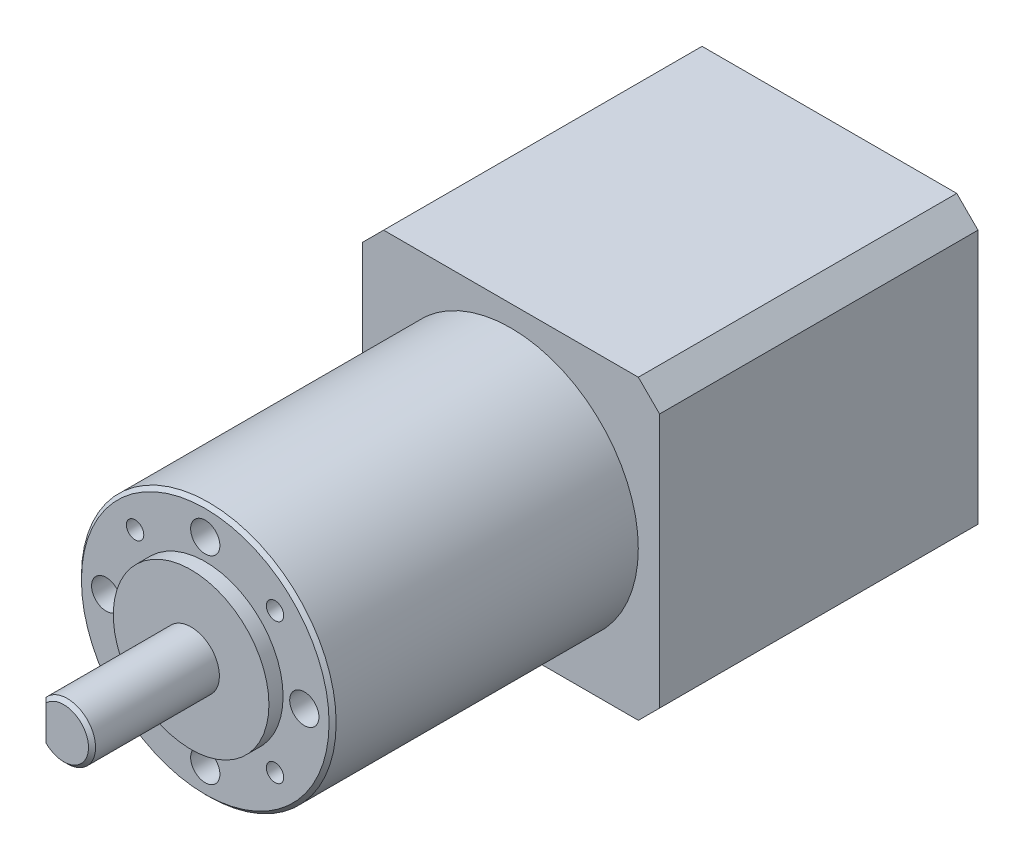
ISO-10303-21;
HEADER;
FILE_DESCRIPTION(('STEP AP214'),'2;1');
FILE_NAME('part.step','',(''),(''),'','','');
FILE_SCHEMA(('AUTOMOTIVE_DESIGN { 1 0 10303 214 1 1 1 1 }'));
ENDSEC;
DATA;
#1=APPLICATION_CONTEXT('core data for automotive mechanical design processes');
#2=APPLICATION_PROTOCOL_DEFINITION('international standard','automotive_design',2000,#1);
#3=PRODUCT_CONTEXT('',#1,'mechanical');
#4=PRODUCT('Part','Part','',(#3));
#5=PRODUCT_RELATED_PRODUCT_CATEGORY('part','',(#4));
#6=PRODUCT_DEFINITION_FORMATION('','',#4);
#7=PRODUCT_DEFINITION_CONTEXT('part definition',#1,'design');
#8=PRODUCT_DEFINITION('design','',#6,#7);
#9=PRODUCT_DEFINITION_SHAPE('','',#8);
#10=(LENGTH_UNIT() NAMED_UNIT(*) SI_UNIT(.MILLI.,.METRE.));
#11=(NAMED_UNIT(*) PLANE_ANGLE_UNIT() SI_UNIT($,.RADIAN.));
#12=(NAMED_UNIT(*) SI_UNIT($,.STERADIAN.) SOLID_ANGLE_UNIT());
#13=UNCERTAINTY_MEASURE_WITH_UNIT(LENGTH_MEASURE(1.E-05),#10,'distance_accuracy_value','');
#14=(GEOMETRIC_REPRESENTATION_CONTEXT(3) GLOBAL_UNCERTAINTY_ASSIGNED_CONTEXT((#13)) GLOBAL_UNIT_ASSIGNED_CONTEXT((#10,
#11,#12)) REPRESENTATION_CONTEXT('',''));
#15=CARTESIAN_POINT('',(0.,0.,0.));
#16=DIRECTION('',(0.,0.,1.));
#17=DIRECTION('',(1.,0.,0.));
#18=AXIS2_PLACEMENT_3D('',#15,#16,#17);
#19=CARTESIAN_POINT('',(42.,0.,45.));
#20=DIRECTION('',(1.,0.,0.));
#21=DIRECTION('',(0.,0.,-1.));
#22=AXIS2_PLACEMENT_3D('',#19,#20,#21);
#23=PLANE('',#22);
#24=DIRECTION('',(0.,1.,0.));
#25=VECTOR('',#24,1.);
#26=CARTESIAN_POINT('',(42.,0.,45.));
#27=LINE('',#26,#25);
#28=CARTESIAN_POINT('',(42.,3.,45.));
#29=VERTEX_POINT('',#28);
#30=CARTESIAN_POINT('',(42.,39.,45.));
#31=VERTEX_POINT('',#30);
#32=EDGE_CURVE('E180',#29,#31,#27,.T.);
#33=ORIENTED_EDGE('',*,*,#32,.F.);
#34=DIRECTION('',(0.,0.,-1.));
#35=VECTOR('',#34,1.);
#36=CARTESIAN_POINT('',(42.,3.,0.));
#37=LINE('',#36,#35);
#38=CARTESIAN_POINT('',(42.,3.,0.));
#39=VERTEX_POINT('',#38);
#40=EDGE_CURVE('E193',#29,#39,#37,.T.);
#41=ORIENTED_EDGE('',*,*,#40,.T.);
#42=DIRECTION('',(0.,1.,0.));
#43=VECTOR('',#42,1.);
#44=CARTESIAN_POINT('',(42.,0.,0.));
#45=LINE('',#44,#43);
#46=CARTESIAN_POINT('',(42.,39.,0.));
#47=VERTEX_POINT('',#46);
#48=EDGE_CURVE('E175',#39,#47,#45,.T.);
#49=ORIENTED_EDGE('',*,*,#48,.T.);
#50=DIRECTION('',(0.,0.,1.));
#51=VECTOR('',#50,1.);
#52=CARTESIAN_POINT('',(42.,39.,45.));
#53=LINE('',#52,#51);
#54=EDGE_CURVE('E183',#47,#31,#53,.T.);
#55=ORIENTED_EDGE('',*,*,#54,.T.);
#56=EDGE_LOOP('',(#33,#41,#49,#55));
#57=FACE_BOUND('',#56,.T.);
#58=ADVANCED_FACE('F46',(#57),#23,.T.);
#59=CARTESIAN_POINT('',(0.,0.,45.));
#60=DIRECTION('',(0.,0.,1.));
#61=DIRECTION('',(1.,0.,0.));
#62=AXIS2_PLACEMENT_3D('',#59,#60,#61);
#63=PLANE('',#62);
#64=CARTESIAN_POINT('',(20.9927320480347,21.0290622711182,45.));
#65=DIRECTION('',(0.,0.,1.));
#66=DIRECTION('',(1.,0.,0.));
#67=AXIS2_PLACEMENT_3D('',#64,#65,#66);
#68=CIRCLE('',#67,18.);
#69=CARTESIAN_POINT('',(2.99273204803469,21.0290622711182,45.));
#70=VERTEX_POINT('',#69);
#71=EDGE_CURVE('E162',#70,#70,#68,.T.);
#72=ORIENTED_EDGE('',*,*,#71,.F.);
#73=EDGE_LOOP('',(#72));
#74=FACE_BOUND('',#73,.T.);
#75=DIRECTION('',(1.,0.,0.));
#76=VECTOR('',#75,1.);
#77=CARTESIAN_POINT('',(0.,0.,45.));
#78=LINE('',#77,#76);
#79=CARTESIAN_POINT('',(3.00000000000001,0.,45.));
#80=VERTEX_POINT('',#79);
#81=CARTESIAN_POINT('',(39.,0.,45.));
#82=VERTEX_POINT('',#81);
#83=EDGE_CURVE('E171',#80,#82,#78,.T.);
#84=ORIENTED_EDGE('',*,*,#83,.T.);
#85=DIRECTION('',(0.707106781186551,0.707106781186544,0.));
#86=VECTOR('',#85,1.);
#87=CARTESIAN_POINT('',(19.4999999999998,-19.5,45.));
#88=LINE('',#87,#86);
#89=EDGE_CURVE('E214',#82,#29,#88,.T.);
#90=ORIENTED_EDGE('',*,*,#89,.T.);
#91=ORIENTED_EDGE('',*,*,#32,.T.);
#92=DIRECTION('',(0.707106781186544,-0.707106781186551,0.));
#93=VECTOR('',#92,1.);
#94=CARTESIAN_POINT('',(40.5000000000002,40.4999999999998,45.));
#95=LINE('',#94,#93);
#96=CARTESIAN_POINT('',(39.,42.,45.));
#97=VERTEX_POINT('',#96);
#98=EDGE_CURVE('E210',#31,#97,#95,.F.);
#99=ORIENTED_EDGE('',*,*,#98,.T.);
#100=DIRECTION('',(1.,0.,0.));
#101=VECTOR('',#100,1.);
#102=CARTESIAN_POINT('',(0.,42.,45.));
#103=LINE('',#102,#101);
#104=CARTESIAN_POINT('',(2.99999999999997,42.,45.));
#105=VERTEX_POINT('',#104);
#106=EDGE_CURVE('E172',#105,#97,#103,.T.);
#107=ORIENTED_EDGE('',*,*,#106,.F.);
#108=DIRECTION('',(0.707106781186546,0.707106781186549,0.));
#109=VECTOR('',#108,1.);
#110=CARTESIAN_POINT('',(-19.5,19.4999999999999,45.));
#111=LINE('',#110,#109);
#112=CARTESIAN_POINT('',(0.,39.,45.));
#113=VERTEX_POINT('',#112);
#114=EDGE_CURVE('E208',#105,#113,#111,.F.);
#115=ORIENTED_EDGE('',*,*,#114,.T.);
#116=DIRECTION('',(0.,1.,0.));
#117=VECTOR('',#116,1.);
#118=CARTESIAN_POINT('',(0.,0.,45.));
#119=LINE('',#118,#117);
#120=CARTESIAN_POINT('',(0.,3.,45.));
#121=VERTEX_POINT('',#120);
#122=EDGE_CURVE('E184',#121,#113,#119,.T.);
#123=ORIENTED_EDGE('',*,*,#122,.F.);
#124=DIRECTION('',(0.707106781186551,-0.707106781186544,0.));
#125=VECTOR('',#124,1.);
#126=CARTESIAN_POINT('',(1.49999999999998,1.50000000000002,45.));
#127=LINE('',#126,#125);
#128=EDGE_CURVE('E212',#121,#80,#127,.T.);
#129=ORIENTED_EDGE('',*,*,#128,.T.);
#130=EDGE_LOOP('',(#84,#90,#91,#99,#107,#115,#123,#129));
#131=FACE_BOUND('',#130,.T.);
#132=ADVANCED_FACE('F254',(#74,#131),#63,.T.);
#133=CARTESIAN_POINT('',(0.,0.,0.));
#134=DIRECTION('',(-1.,0.,0.));
#135=DIRECTION('',(0.,0.,1.));
#136=AXIS2_PLACEMENT_3D('',#133,#134,#135);
#137=PLANE('',#136);
#138=DIRECTION('',(0.,1.,0.));
#139=VECTOR('',#138,1.);
#140=CARTESIAN_POINT('',(0.,0.,0.));
#141=LINE('',#140,#139);
#142=CARTESIAN_POINT('',(0.,3.,0.));
#143=VERTEX_POINT('',#142);
#144=CARTESIAN_POINT('',(0.,39.,0.));
#145=VERTEX_POINT('',#144);
#146=EDGE_CURVE('E187',#143,#145,#141,.T.);
#147=ORIENTED_EDGE('',*,*,#146,.F.);
#148=DIRECTION('',(0.,0.,1.));
#149=VECTOR('',#148,1.);
#150=CARTESIAN_POINT('',(0.,3.,45.));
#151=LINE('',#150,#149);
#152=EDGE_CURVE('E218',#143,#121,#151,.T.);
#153=ORIENTED_EDGE('',*,*,#152,.T.);
#154=ORIENTED_EDGE('',*,*,#122,.T.);
#155=DIRECTION('',(0.,0.,-1.));
#156=VECTOR('',#155,1.);
#157=CARTESIAN_POINT('',(0.,39.,0.));
#158=LINE('',#157,#156);
#159=EDGE_CURVE('E216',#113,#145,#158,.T.);
#160=ORIENTED_EDGE('',*,*,#159,.T.);
#161=EDGE_LOOP('',(#147,#153,#154,#160));
#162=FACE_BOUND('',#161,.T.);
#163=ADVANCED_FACE('F260',(#162),#137,.T.);
#164=CARTESIAN_POINT('',(42.,0.,0.));
#165=DIRECTION('',(0.,0.,-1.));
#166=DIRECTION('',(-1.,0.,0.));
#167=AXIS2_PLACEMENT_3D('',#164,#165,#166);
#168=PLANE('',#167);
#169=ORIENTED_EDGE('',*,*,#48,.F.);
#170=DIRECTION('',(-0.707106781186551,-0.707106781186544,0.));
#171=VECTOR('',#170,1.);
#172=CARTESIAN_POINT('',(40.5,1.50000000000002,0.));
#173=LINE('',#172,#171);
#174=CARTESIAN_POINT('',(39.,0.,0.));
#175=VERTEX_POINT('',#174);
#176=EDGE_CURVE('E202',#39,#175,#173,.T.);
#177=ORIENTED_EDGE('',*,*,#176,.T.);
#178=DIRECTION('',(-1.,0.,0.));
#179=VECTOR('',#178,1.);
#180=CARTESIAN_POINT('',(42.,0.,0.));
#181=LINE('',#180,#179);
#182=CARTESIAN_POINT('',(3.00000000000001,0.,0.));
#183=VERTEX_POINT('',#182);
#184=EDGE_CURVE('E168',#175,#183,#181,.T.);
#185=ORIENTED_EDGE('',*,*,#184,.T.);
#186=DIRECTION('',(-0.707106781186551,0.707106781186544,0.));
#187=VECTOR('',#186,1.);
#188=CARTESIAN_POINT('',(22.5000000000002,-19.5,0.));
#189=LINE('',#188,#187);
#190=EDGE_CURVE('E200',#183,#143,#189,.T.);
#191=ORIENTED_EDGE('',*,*,#190,.T.);
#192=ORIENTED_EDGE('',*,*,#146,.T.);
#193=DIRECTION('',(-0.707106781186546,-0.707106781186549,0.));
#194=VECTOR('',#193,1.);
#195=CARTESIAN_POINT('',(1.4999999999999,40.4999999999999,0.));
#196=LINE('',#195,#194);
#197=CARTESIAN_POINT('',(2.99999999999997,42.,0.));
#198=VERTEX_POINT('',#197);
#199=EDGE_CURVE('E196',#145,#198,#196,.F.);
#200=ORIENTED_EDGE('',*,*,#199,.T.);
#201=DIRECTION('',(-1.,0.,0.));
#202=VECTOR('',#201,1.);
#203=CARTESIAN_POINT('',(42.,42.,0.));
#204=LINE('',#203,#202);
#205=CARTESIAN_POINT('',(39.,42.,0.));
#206=VERTEX_POINT('',#205);
#207=EDGE_CURVE('E167',#206,#198,#204,.T.);
#208=ORIENTED_EDGE('',*,*,#207,.F.);
#209=DIRECTION('',(-0.707106781186544,0.707106781186551,0.));
#210=VECTOR('',#209,1.);
#211=CARTESIAN_POINT('',(61.5,19.4999999999998,0.));
#212=LINE('',#211,#210);
#213=EDGE_CURVE('E198',#206,#47,#212,.F.);
#214=ORIENTED_EDGE('',*,*,#213,.T.);
#215=EDGE_LOOP('',(#169,#177,#185,#191,#192,#200,#208,#214));
#216=FACE_BOUND('',#215,.T.);
#217=ADVANCED_FACE('F266',(#216),#168,.T.);
#218=CARTESIAN_POINT('',(0.,0.,0.));
#219=DIRECTION('',(0.,1.,0.));
#220=DIRECTION('',(0.,0.,1.));
#221=AXIS2_PLACEMENT_3D('',#218,#219,#220);
#222=PLANE('',#221);
#223=ORIENTED_EDGE('',*,*,#184,.F.);
#224=DIRECTION('',(0.,0.,1.));
#225=VECTOR('',#224,1.);
#226=CARTESIAN_POINT('',(39.,0.,45.));
#227=LINE('',#226,#225);
#228=EDGE_CURVE('E206',#175,#82,#227,.T.);
#229=ORIENTED_EDGE('',*,*,#228,.T.);
#230=ORIENTED_EDGE('',*,*,#83,.F.);
#231=DIRECTION('',(0.,0.,-1.));
#232=VECTOR('',#231,1.);
#233=CARTESIAN_POINT('',(3.00000000000001,0.,0.));
#234=LINE('',#233,#232);
#235=EDGE_CURVE('E204',#80,#183,#234,.T.);
#236=ORIENTED_EDGE('',*,*,#235,.T.);
#237=EDGE_LOOP('',(#223,#229,#230,#236));
#238=FACE_BOUND('',#237,.T.);
#239=ADVANCED_FACE('F303',(#238),#222,.F.);
#240=CARTESIAN_POINT('',(0.,42.,0.));
#241=DIRECTION('',(0.,1.,0.));
#242=DIRECTION('',(0.,0.,1.));
#243=AXIS2_PLACEMENT_3D('',#240,#241,#242);
#244=PLANE('',#243);
#245=ORIENTED_EDGE('',*,*,#106,.T.);
#246=DIRECTION('',(0.,0.,-1.));
#247=VECTOR('',#246,1.);
#248=CARTESIAN_POINT('',(39.,42.,0.));
#249=LINE('',#248,#247);
#250=EDGE_CURVE('E224',#97,#206,#249,.T.);
#251=ORIENTED_EDGE('',*,*,#250,.T.);
#252=ORIENTED_EDGE('',*,*,#207,.T.);
#253=DIRECTION('',(0.,0.,1.));
#254=VECTOR('',#253,1.);
#255=CARTESIAN_POINT('',(2.99999999999997,42.,0.));
#256=LINE('',#255,#254);
#257=EDGE_CURVE('E221',#198,#105,#256,.T.);
#258=ORIENTED_EDGE('',*,*,#257,.T.);
#259=EDGE_LOOP('',(#245,#251,#252,#258));
#260=FACE_BOUND('',#259,.T.);
#261=ADVANCED_FACE('F292',(#260),#244,.T.);
#262=CARTESIAN_POINT('',(20.9927320480347,21.0290622711182,88.2));
#263=DIRECTION('',(0.,0.,-1.));
#264=DIRECTION('',(-1.,0.,0.));
#265=AXIS2_PLACEMENT_3D('',#262,#263,#264);
#266=CYLINDRICAL_SURFACE('',#265,18.);
#267=CARTESIAN_POINT('',(20.9927320480347,21.0290622711182,87.6999999999999));
#268=DIRECTION('',(0.,0.,1.));
#269=DIRECTION('',(1.,0.,0.));
#270=AXIS2_PLACEMENT_3D('',#267,#268,#269);
#271=CIRCLE('',#270,18.);
#272=CARTESIAN_POINT('',(2.99273204803469,21.0290622711182,87.6999999999999));
#273=VERTEX_POINT('',#272);
#274=EDGE_CURVE('E13',#273,#273,#271,.F.);
#275=CARTESIAN_POINT('',(2.99273204803469,21.0290622711182,87.6999999999999));
#276=CARTESIAN_POINT('',(2.99273204803469,21.0290622711182,87.2552083333332));
#277=CARTESIAN_POINT('',(2.99273204803469,21.0290622711182,86.8104166666666));
#278=CARTESIAN_POINT('',(2.99273204803469,21.0290622711182,85.9208333333332));
#279=CARTESIAN_POINT('',(2.99273204803469,21.0290622711182,85.4760416666666));
#280=CARTESIAN_POINT('',(2.99273204803469,21.0290622711182,84.5864583333332));
#281=CARTESIAN_POINT('',(2.99273204803469,21.0290622711182,84.1416666666666));
#282=CARTESIAN_POINT('',(2.99273204803469,21.0290622711182,83.2520833333332));
#283=CARTESIAN_POINT('',(2.99273204803469,21.0290622711182,82.8072916666666));
#284=CARTESIAN_POINT('',(2.99273204803469,21.0290622711182,81.9177083333332));
#285=CARTESIAN_POINT('',(2.99273204803469,21.0290622711182,81.4729166666666));
#286=CARTESIAN_POINT('',(2.99273204803469,21.0290622711182,80.5833333333332));
#287=CARTESIAN_POINT('',(2.99273204803469,21.0290622711182,80.1385416666666));
#288=CARTESIAN_POINT('',(2.99273204803469,21.0290622711182,79.2489583333332));
#289=CARTESIAN_POINT('',(2.99273204803469,21.0290622711182,78.8041666666666));
#290=CARTESIAN_POINT('',(2.99273204803469,21.0290622711182,77.9145833333332));
#291=CARTESIAN_POINT('',(2.99273204803469,21.0290622711182,77.4697916666666));
#292=CARTESIAN_POINT('',(2.99273204803469,21.0290622711182,76.5802083333333));
#293=CARTESIAN_POINT('',(2.99273204803469,21.0290622711182,76.1354166666666));
#294=CARTESIAN_POINT('',(2.99273204803469,21.0290622711182,75.2458333333333));
#295=CARTESIAN_POINT('',(2.99273204803469,21.0290622711182,74.8010416666666));
#296=CARTESIAN_POINT('',(2.99273204803469,21.0290622711182,73.9114583333333));
#297=CARTESIAN_POINT('',(2.99273204803469,21.0290622711182,73.4666666666666));
#298=CARTESIAN_POINT('',(2.99273204803469,21.0290622711182,72.5770833333333));
#299=CARTESIAN_POINT('',(2.99273204803469,21.0290622711182,72.1322916666666));
#300=CARTESIAN_POINT('',(2.99273204803469,21.0290622711182,71.2427083333333));
#301=CARTESIAN_POINT('',(2.99273204803469,21.0290622711182,70.7979166666666));
#302=CARTESIAN_POINT('',(2.99273204803469,21.0290622711182,69.9083333333333));
#303=CARTESIAN_POINT('',(2.99273204803469,21.0290622711182,69.4635416666666));
#304=CARTESIAN_POINT('',(2.99273204803469,21.0290622711182,68.5739583333333));
#305=CARTESIAN_POINT('',(2.99273204803469,21.0290622711182,68.1291666666666));
#306=CARTESIAN_POINT('',(2.99273204803469,21.0290622711182,67.2395833333333));
#307=CARTESIAN_POINT('',(2.99273204803469,21.0290622711182,66.7947916666666));
#308=CARTESIAN_POINT('',(2.99273204803469,21.0290622711182,65.9052083333333));
#309=CARTESIAN_POINT('',(2.99273204803469,21.0290622711182,65.4604166666666));
#310=CARTESIAN_POINT('',(2.99273204803469,21.0290622711182,64.5708333333333));
#311=CARTESIAN_POINT('',(2.99273204803469,21.0290622711182,64.1260416666666));
#312=CARTESIAN_POINT('',(2.99273204803469,21.0290622711182,63.2364583333333));
#313=CARTESIAN_POINT('',(2.99273204803469,21.0290622711182,62.7916666666666));
#314=CARTESIAN_POINT('',(2.99273204803469,21.0290622711182,61.9020833333333));
#315=CARTESIAN_POINT('',(2.99273204803469,21.0290622711182,61.4572916666666));
#316=CARTESIAN_POINT('',(2.99273204803469,21.0290622711182,60.5677083333333));
#317=CARTESIAN_POINT('',(2.99273204803469,21.0290622711182,60.1229166666666));
#318=CARTESIAN_POINT('',(2.99273204803469,21.0290622711182,59.2333333333333));
#319=CARTESIAN_POINT('',(2.99273204803469,21.0290622711182,58.7885416666666));
#320=CARTESIAN_POINT('',(2.99273204803469,21.0290622711182,57.8989583333333));
#321=CARTESIAN_POINT('',(2.99273204803469,21.0290622711182,57.4541666666666));
#322=CARTESIAN_POINT('',(2.99273204803469,21.0290622711182,56.5645833333333));
#323=CARTESIAN_POINT('',(2.99273204803469,21.0290622711182,56.1197916666666));
#324=CARTESIAN_POINT('',(2.99273204803469,21.0290622711182,55.2302083333333));
#325=CARTESIAN_POINT('',(2.99273204803469,21.0290622711182,54.7854166666666));
#326=CARTESIAN_POINT('',(2.99273204803469,21.0290622711182,53.8958333333333));
#327=CARTESIAN_POINT('',(2.99273204803469,21.0290622711182,53.4510416666666));
#328=CARTESIAN_POINT('',(2.99273204803469,21.0290622711182,52.5614583333333));
#329=CARTESIAN_POINT('',(2.99273204803469,21.0290622711182,52.1166666666666));
#330=CARTESIAN_POINT('',(2.99273204803469,21.0290622711182,51.2270833333333));
#331=CARTESIAN_POINT('',(2.99273204803469,21.0290622711182,50.7822916666666));
#332=CARTESIAN_POINT('',(2.99273204803469,21.0290622711182,49.8927083333333));
#333=CARTESIAN_POINT('',(2.99273204803469,21.0290622711182,49.4479166666667));
#334=CARTESIAN_POINT('',(2.99273204803469,21.0290622711182,48.5583333333333));
#335=CARTESIAN_POINT('',(2.99273204803469,21.0290622711182,48.1135416666667));
#336=CARTESIAN_POINT('',(2.99273204803469,21.0290622711182,47.2239583333333));
#337=CARTESIAN_POINT('',(2.99273204803469,21.0290622711182,46.7791666666667));
#338=CARTESIAN_POINT('',(2.99273204803469,21.0290622711182,45.8895833333333));
#339=CARTESIAN_POINT('',(2.99273204803469,21.0290622711182,45.4447916666667));
#340=CARTESIAN_POINT('',(2.99273204803469,21.0290622711182,45.));
#341=B_SPLINE_CURVE_WITH_KNOTS('',3,(#275,#276,#277,#278,#279,#280,#281,#282,#283,#284,#285,
#286,#287,#288,#289,#290,#291,#292,#293,#294,#295,#296,#297,#298,#299,#300,#301,#302,#303,#304,
#305,#306,#307,#308,#309,#310,#311,#312,#313,#314,#315,#316,#317,#318,#319,#320,#321,#322,#323,
#324,#325,#326,#327,#328,#329,#330,#331,#332,#333,#334,#335,#336,#337,#338,#339,#340),
.UNSPECIFIED.,.F.,.F.,(4,2,2,2,2,2,2,2,2,2,2,2,2,2,2,2,2,2,2,2,2,2,2,2,2,2,2,2,2,2,2,2,4),(0.,
1.334375,2.66875,4.003125,5.3375,6.67187499999999,8.00624999999999,9.34062499999999,10.675,
12.009375,13.34375,14.678125,16.0125,17.346875,18.68125,20.015625,21.35,22.684375,24.01875,
25.3531249999999,26.6874999999999,28.0218749999999,29.3562499999999,30.6906249999999,
32.0249999999999,33.3593749999999,34.6937499999999,36.0281249999999,37.3624999999999,
38.6968749999999,40.0312499999999,41.3656249999999,42.6999999999999),.UNSPECIFIED.);
#342=EDGE_CURVE('BSEAM317',#273,#70,#341,.T.);
#343=ORIENTED_EDGE('',*,*,#274,.T.);
#344=ORIENTED_EDGE('',*,*,#71,.T.);
#345=ORIENTED_EDGE('',*,*,#342,.T.);
#346=ORIENTED_EDGE('',*,*,#342,.F.);
#347=EDGE_LOOP('',(#343,#345,#344,#346));
#348=FACE_BOUND('',#347,.T.);
#349=ADVANCED_FACE('F317',(#348),#266,.T.);
#350=CARTESIAN_POINT('',(20.9927320480347,21.0290622711182,88.2));
#351=DIRECTION('',(0.,0.,1.));
#352=DIRECTION('',(1.,0.,0.));
#353=AXIS2_PLACEMENT_3D('',#350,#351,#352);
#354=PLANE('',#353);
#355=CARTESIAN_POINT('',(20.9927320480347,21.0290622711182,88.2));
#356=DIRECTION('',(0.,0.,1.));
#357=DIRECTION('',(1.,0.,0.));
#358=AXIS2_PLACEMENT_3D('',#355,#356,#357);
#359=CIRCLE('',#358,17.4999999999999);
#360=CARTESIAN_POINT('',(38.4927320480346,21.0290622711182,88.2));
#361=VERTEX_POINT('',#360);
#362=EDGE_CURVE('E59',#361,#361,#359,.T.);
#363=ORIENTED_EDGE('',*,*,#362,.T.);
#364=EDGE_LOOP('',(#363));
#365=FACE_BOUND('',#364,.T.);
#366=CARTESIAN_POINT('',(6.9927320480347,21.0290622711182,88.2));
#367=DIRECTION('',(0.,0.,1.));
#368=DIRECTION('',(1.,0.,0.));
#369=AXIS2_PLACEMENT_3D('',#366,#367,#368);
#370=CIRCLE('',#369,2.06699999999999);
#371=CARTESIAN_POINT('',(9.05973204803469,21.0290622711182,88.2));
#372=VERTEX_POINT('',#371);
#373=EDGE_CURVE('E415',#372,#372,#370,.T.);
#374=ORIENTED_EDGE('',*,*,#373,.F.);
#375=EDGE_LOOP('',(#374));
#376=FACE_BOUND('',#375,.T.);
#377=CARTESIAN_POINT('',(34.9927320480347,21.0290622711182,88.2));
#378=DIRECTION('',(0.,0.,1.));
#379=DIRECTION('',(1.,0.,0.));
#380=AXIS2_PLACEMENT_3D('',#377,#378,#379);
#381=CIRCLE('',#380,2.06699999999999);
#382=CARTESIAN_POINT('',(37.0597320480347,21.0290622711182,88.2));
#383=VERTEX_POINT('',#382);
#384=EDGE_CURVE('E418',#383,#383,#381,.T.);
#385=ORIENTED_EDGE('',*,*,#384,.F.);
#386=EDGE_LOOP('',(#385));
#387=FACE_BOUND('',#386,.T.);
#388=CARTESIAN_POINT('',(20.9927320480346,7.0290622711182,88.2));
#389=DIRECTION('',(0.,0.,1.));
#390=DIRECTION('',(1.,0.,0.));
#391=AXIS2_PLACEMENT_3D('',#388,#389,#390);
#392=CIRCLE('',#391,2.06699999999999);
#393=CARTESIAN_POINT('',(23.0597320480346,7.0290622711182,88.2));
#394=VERTEX_POINT('',#393);
#395=EDGE_CURVE('E426',#394,#394,#392,.T.);
#396=ORIENTED_EDGE('',*,*,#395,.F.);
#397=EDGE_LOOP('',(#396));
#398=FACE_BOUND('',#397,.T.);
#399=CARTESIAN_POINT('',(20.9927320480347,35.0290622711182,88.2));
#400=DIRECTION('',(0.,0.,1.));
#401=DIRECTION('',(1.,0.,0.));
#402=AXIS2_PLACEMENT_3D('',#399,#400,#401);
#403=CIRCLE('',#402,2.06699999999999);
#404=CARTESIAN_POINT('',(23.0597320480347,35.0290622711182,88.2));
#405=VERTEX_POINT('',#404);
#406=EDGE_CURVE('E432',#405,#405,#403,.T.);
#407=ORIENTED_EDGE('',*,*,#406,.F.);
#408=EDGE_LOOP('',(#407));
#409=FACE_BOUND('',#408,.T.);
#410=CARTESIAN_POINT('',(11.0757648944855,30.9626388549805,88.2));
#411=DIRECTION('',(0.,0.,1.));
#412=DIRECTION('',(1.,0.,0.));
#413=AXIS2_PLACEMENT_3D('',#410,#411,#412);
#414=CIRCLE('',#413,1.22949999999999);
#415=CARTESIAN_POINT('',(12.3052648944855,30.9626388549805,88.2));
#416=VERTEX_POINT('',#415);
#417=EDGE_CURVE('E438',#416,#416,#414,.T.);
#418=ORIENTED_EDGE('',*,*,#417,.F.);
#419=EDGE_LOOP('',(#418));
#420=FACE_BOUND('',#419,.T.);
#421=CARTESIAN_POINT('',(30.8575010299683,30.9626388549805,88.2));
#422=DIRECTION('',(0.,0.,1.));
#423=DIRECTION('',(1.,0.,0.));
#424=AXIS2_PLACEMENT_3D('',#421,#422,#423);
#425=CIRCLE('',#424,1.22949999999999);
#426=CARTESIAN_POINT('',(32.0870010299683,30.9626388549805,88.2));
#427=VERTEX_POINT('',#426);
#428=EDGE_CURVE('E444',#427,#427,#425,.T.);
#429=ORIENTED_EDGE('',*,*,#428,.F.);
#430=EDGE_LOOP('',(#429));
#431=FACE_BOUND('',#430,.T.);
#432=CARTESIAN_POINT('',(11.0757648944855,11.1431205272675,88.2));
#433=DIRECTION('',(0.,0.,1.));
#434=DIRECTION('',(1.,0.,0.));
#435=AXIS2_PLACEMENT_3D('',#432,#433,#434);
#436=CIRCLE('',#435,1.22949999999999);
#437=CARTESIAN_POINT('',(12.3052648944855,11.1431205272675,88.2));
#438=VERTEX_POINT('',#437);
#439=EDGE_CURVE('E450',#438,#438,#436,.T.);
#440=ORIENTED_EDGE('',*,*,#439,.F.);
#441=EDGE_LOOP('',(#440));
#442=FACE_BOUND('',#441,.T.);
#443=CARTESIAN_POINT('',(30.8575010299683,11.1431205272675,88.2));
#444=DIRECTION('',(0.,0.,1.));
#445=DIRECTION('',(1.,0.,0.));
#446=AXIS2_PLACEMENT_3D('',#443,#444,#445);
#447=CIRCLE('',#446,1.22949999999999);
#448=CARTESIAN_POINT('',(32.0870010299683,11.1431205272675,88.2));
#449=VERTEX_POINT('',#448);
#450=EDGE_CURVE('E456',#449,#449,#447,.T.);
#451=ORIENTED_EDGE('',*,*,#450,.F.);
#452=EDGE_LOOP('',(#451));
#453=FACE_BOUND('',#452,.T.);
#454=CARTESIAN_POINT('',(20.9927320480347,21.0290622711182,88.2));
#455=DIRECTION('',(0.,0.,1.));
#456=DIRECTION('',(1.,0.,0.));
#457=AXIS2_PLACEMENT_3D('',#454,#455,#456);
#458=CIRCLE('',#457,11.);
#459=CARTESIAN_POINT('',(31.9927320480347,21.0290622711182,88.2));
#460=VERTEX_POINT('',#459);
#461=EDGE_CURVE('E158',#460,#460,#458,.T.);
#462=ORIENTED_EDGE('',*,*,#461,.F.);
#463=EDGE_LOOP('',(#462));
#464=FACE_BOUND('',#463,.T.);
#465=ADVANCED_FACE('F322',(#365,#376,#387,#398,#409,#420,#431,#442,#453,#464),#354,.T.);
#466=CARTESIAN_POINT('',(20.9927320480347,21.0290622711182,90.2));
#467=DIRECTION('',(0.,0.,-1.));
#468=DIRECTION('',(-1.,0.,0.));
#469=AXIS2_PLACEMENT_3D('',#466,#467,#468);
#470=CYLINDRICAL_SURFACE('',#469,11.);
#471=CARTESIAN_POINT('',(20.9927320480347,21.0290622711182,90.2));
#472=DIRECTION('',(0.,0.,1.));
#473=DIRECTION('',(1.,0.,0.));
#474=AXIS2_PLACEMENT_3D('',#471,#472,#473);
#475=CIRCLE('',#474,11.);
#476=CARTESIAN_POINT('',(31.9927320480347,21.0290622711182,90.2));
#477=VERTEX_POINT('',#476);
#478=EDGE_CURVE('E159',#477,#477,#475,.T.);
#479=ORIENTED_EDGE('',*,*,#478,.F.);
#480=EDGE_LOOP('',(#479));
#481=FACE_BOUND('',#480,.T.);
#482=ORIENTED_EDGE('',*,*,#461,.T.);
#483=EDGE_LOOP('',(#482));
#484=FACE_BOUND('',#483,.T.);
#485=ADVANCED_FACE('F326',(#481,#484),#470,.T.);
#486=CARTESIAN_POINT('',(20.9927320480347,21.0290622711182,90.2));
#487=DIRECTION('',(0.,0.,1.));
#488=DIRECTION('',(1.,0.,0.));
#489=AXIS2_PLACEMENT_3D('',#486,#487,#488);
#490=PLANE('',#489);
#491=CARTESIAN_POINT('',(20.9927320480347,21.0290622711182,90.2));
#492=DIRECTION('',(0.,0.,1.));
#493=DIRECTION('',(1.,0.,0.));
#494=AXIS2_PLACEMENT_3D('',#491,#492,#493);
#495=CIRCLE('',#494,4.);
#496=CARTESIAN_POINT('',(24.9927320480347,21.0290622711182,90.2));
#497=VERTEX_POINT('',#496);
#498=EDGE_CURVE('E153',#497,#497,#495,.T.);
#499=ORIENTED_EDGE('',*,*,#498,.F.);
#500=EDGE_LOOP('',(#499));
#501=FACE_BOUND('',#500,.T.);
#502=ORIENTED_EDGE('',*,*,#478,.T.);
#503=EDGE_LOOP('',(#502));
#504=FACE_BOUND('',#503,.T.);
#505=ADVANCED_FACE('F330',(#501,#504),#490,.T.);
#506=CARTESIAN_POINT('',(20.9927320480347,21.0290622711182,108.2));
#507=DIRECTION('',(0.,0.,-1.));
#508=DIRECTION('',(-1.,0.,0.));
#509=AXIS2_PLACEMENT_3D('',#506,#507,#508);
#510=CYLINDRICAL_SURFACE('',#509,4.);
#511=DIRECTION('',(0.,0.,1.));
#512=VECTOR('',#511,1.);
#513=CARTESIAN_POINT('',(18.0045451470441,23.6881484007403,93.2));
#514=LINE('',#513,#512);
#515=CARTESIAN_POINT('',(18.0045451470441,23.6881484007403,93.2));
#516=VERTEX_POINT('',#515);
#517=CARTESIAN_POINT('',(18.0045451470441,23.6881484007403,107.7));
#518=VERTEX_POINT('',#517);
#519=EDGE_CURVE('E146',#516,#518,#514,.T.);
#520=ORIENTED_EDGE('',*,*,#519,.T.);
#521=CARTESIAN_POINT('',(20.9927320480347,21.0290622711182,107.7));
#522=DIRECTION('',(0.,0.,1.));
#523=DIRECTION('',(1.,0.,0.));
#524=AXIS2_PLACEMENT_3D('',#521,#522,#523);
#525=CIRCLE('',#524,4.);
#526=CARTESIAN_POINT('',(17.9875202144451,18.3892323835586,107.7));
#527=VERTEX_POINT('',#526);
#528=EDGE_CURVE('E151',#518,#527,#525,.F.);
#529=ORIENTED_EDGE('',*,*,#528,.T.);
#530=DIRECTION('',(0.,0.,1.));
#531=VECTOR('',#530,1.);
#532=CARTESIAN_POINT('',(17.9875202144451,18.3892323835586,93.2));
#533=LINE('',#532,#531);
#534=CARTESIAN_POINT('',(17.9875202144451,18.3892323835586,93.2));
#535=VERTEX_POINT('',#534);
#536=EDGE_CURVE('E145',#535,#527,#533,.T.);
#537=ORIENTED_EDGE('',*,*,#536,.F.);
#538=CARTESIAN_POINT('',(20.9927320480347,21.0290622711182,93.2));
#539=DIRECTION('',(0.,0.,1.));
#540=DIRECTION('',(1.,0.,0.));
#541=AXIS2_PLACEMENT_3D('',#538,#539,#540);
#542=CIRCLE('',#541,4.);
#543=EDGE_CURVE('E136',#516,#535,#542,.T.);
#544=ORIENTED_EDGE('',*,*,#543,.F.);
#545=EDGE_LOOP('',(#520,#529,#537,#544));
#546=FACE_BOUND('',#545,.T.);
#547=ORIENTED_EDGE('',*,*,#498,.T.);
#548=EDGE_LOOP('',(#547));
#549=FACE_BOUND('',#548,.T.);
#550=ADVANCED_FACE('F149',(#546,#549),#510,.T.);
#551=CARTESIAN_POINT('',(20.9927320480347,21.0290622711182,108.2));
#552=DIRECTION('',(0.,0.,1.));
#553=DIRECTION('',(1.,0.,0.));
#554=AXIS2_PLACEMENT_3D('',#551,#552,#553);
#555=PLANE('',#554);
#556=DIRECTION('',(-0.00321289197115424,-0.999994838649271,0.));
#557=VECTOR('',#556,1.);
#558=CARTESIAN_POINT('',(18.4875176337699,18.387625937573,108.2));
#559=LINE('',#558,#557);
#560=CARTESIAN_POINT('',(18.503910804098,23.4899094455133,108.2));
#561=VERTEX_POINT('',#560);
#562=CARTESIAN_POINT('',(18.4881493960408,18.5842584468145,108.2));
#563=VERTEX_POINT('',#562);
#564=EDGE_CURVE('E227',#561,#563,#559,.T.);
#565=ORIENTED_EDGE('',*,*,#564,.T.);
#566=CARTESIAN_POINT('',(20.9927320480347,21.0290622711182,108.2));
#567=DIRECTION('',(0.,0.,1.));
#568=DIRECTION('',(1.,0.,0.));
#569=AXIS2_PLACEMENT_3D('',#566,#567,#568);
#570=CIRCLE('',#569,3.49999999999984);
#571=EDGE_CURVE('E229',#563,#561,#570,.T.);
#572=ORIENTED_EDGE('',*,*,#571,.T.);
#573=EDGE_LOOP('',(#565,#572));
#574=FACE_BOUND('',#573,.T.);
#575=ADVANCED_FACE('F337',(#574),#555,.T.);
#576=CARTESIAN_POINT('',(17.9875202144451,18.3892323835586,93.2));
#577=DIRECTION('',(0.999994838649271,-0.00321289197115424,0.));
#578=DIRECTION('',(0.00321289197115424,0.999994838649271,0.));
#579=AXIS2_PLACEMENT_3D('',#576,#577,#578);
#580=PLANE('',#579);
#581=ORIENTED_EDGE('',*,*,#536,.T.);
#582=DIRECTION('',(0.00321289197115424,0.999994838649271,0.));
#583=VECTOR('',#582,1.);
#584=CARTESIAN_POINT('',(18.0045451470441,23.6881484007403,107.7));
#585=LINE('',#584,#583);
#586=EDGE_CURVE('E67',#527,#518,#585,.T.);
#587=ORIENTED_EDGE('',*,*,#586,.T.);
#588=ORIENTED_EDGE('',*,*,#519,.F.);
#589=DIRECTION('',(0.00321289197115424,0.999994838649271,0.));
#590=VECTOR('',#589,1.);
#591=CARTESIAN_POINT('',(17.9875202144451,18.3892323835586,93.2));
#592=LINE('',#591,#590);
#593=EDGE_CURVE('E139',#535,#516,#592,.T.);
#594=ORIENTED_EDGE('',*,*,#593,.F.);
#595=EDGE_LOOP('',(#581,#587,#588,#594));
#596=FACE_BOUND('',#595,.T.);
#597=ADVANCED_FACE('F144',(#596),#580,.F.);
#598=CARTESIAN_POINT('',(20.9927320480347,21.0290622711182,93.2));
#599=DIRECTION('',(0.,0.,1.));
#600=DIRECTION('',(1.,0.,0.));
#601=AXIS2_PLACEMENT_3D('',#598,#599,#600);
#602=PLANE('',#601);
#603=ORIENTED_EDGE('',*,*,#543,.T.);
#604=ORIENTED_EDGE('',*,*,#593,.T.);
#605=EDGE_LOOP('',(#603,#604));
#606=FACE_BOUND('',#605,.T.);
#607=ADVANCED_FACE('F138',(#606),#602,.T.);
#608=CARTESIAN_POINT('',(30.8575010299683,11.1431205272675,84.2));
#609=DIRECTION('',(0.,0.,-1.));
#610=DIRECTION('',(-1.,0.,0.));
#611=AXIS2_PLACEMENT_3D('',#608,#609,#610);
#612=PLANE('',#611);
#613=CARTESIAN_POINT('',(30.8575010299683,11.1431205272675,84.2));
#614=DIRECTION('',(0.,0.,1.));
#615=DIRECTION('',(1.,0.,0.));
#616=AXIS2_PLACEMENT_3D('',#613,#614,#615);
#617=CIRCLE('',#616,1.22949999999999);
#618=CARTESIAN_POINT('',(32.0870010299683,11.1431205272675,84.2));
#619=VERTEX_POINT('',#618);
#620=EDGE_CURVE('E142',#619,#619,#617,.T.);
#621=ORIENTED_EDGE('',*,*,#620,.T.);
#622=EDGE_LOOP('',(#621));
#623=FACE_BOUND('',#622,.T.);
#624=ADVANCED_FACE('F345',(#623),#612,.F.);
#625=CARTESIAN_POINT('',(30.8575010299683,11.1431205272675,88.2));
#626=DIRECTION('',(0.,0.,1.));
#627=DIRECTION('',(1.,0.,0.));
#628=AXIS2_PLACEMENT_3D('',#625,#626,#627);
#629=CYLINDRICAL_SURFACE('',#628,1.22949999999999);
#630=ORIENTED_EDGE('',*,*,#620,.F.);
#631=EDGE_LOOP('',(#630));
#632=FACE_BOUND('',#631,.T.);
#633=ORIENTED_EDGE('',*,*,#450,.T.);
#634=EDGE_LOOP('',(#633));
#635=FACE_BOUND('',#634,.T.);
#636=ADVANCED_FACE('F348',(#632,#635),#629,.F.);
#637=CARTESIAN_POINT('',(11.0757648944855,11.1431205272675,84.2));
#638=DIRECTION('',(0.,0.,-1.));
#639=DIRECTION('',(-1.,0.,0.));
#640=AXIS2_PLACEMENT_3D('',#637,#638,#639);
#641=PLANE('',#640);
#642=CARTESIAN_POINT('',(11.0757648944855,11.1431205272675,84.2));
#643=DIRECTION('',(0.,0.,1.));
#644=DIRECTION('',(1.,0.,0.));
#645=AXIS2_PLACEMENT_3D('',#642,#643,#644);
#646=CIRCLE('',#645,1.22949999999999);
#647=CARTESIAN_POINT('',(12.3052648944855,11.1431205272675,84.2));
#648=VERTEX_POINT('',#647);
#649=EDGE_CURVE('E453',#648,#648,#646,.T.);
#650=ORIENTED_EDGE('',*,*,#649,.T.);
#651=EDGE_LOOP('',(#650));
#652=FACE_BOUND('',#651,.T.);
#653=ADVANCED_FACE('F352',(#652),#641,.F.);
#654=CARTESIAN_POINT('',(11.0757648944855,11.1431205272675,88.2));
#655=DIRECTION('',(0.,0.,1.));
#656=DIRECTION('',(1.,0.,0.));
#657=AXIS2_PLACEMENT_3D('',#654,#655,#656);
#658=CYLINDRICAL_SURFACE('',#657,1.22949999999999);
#659=ORIENTED_EDGE('',*,*,#649,.F.);
#660=EDGE_LOOP('',(#659));
#661=FACE_BOUND('',#660,.T.);
#662=ORIENTED_EDGE('',*,*,#439,.T.);
#663=EDGE_LOOP('',(#662));
#664=FACE_BOUND('',#663,.T.);
#665=ADVANCED_FACE('F356',(#661,#664),#658,.F.);
#666=CARTESIAN_POINT('',(30.8575010299683,30.9626388549805,84.2));
#667=DIRECTION('',(0.,0.,-1.));
#668=DIRECTION('',(-1.,0.,0.));
#669=AXIS2_PLACEMENT_3D('',#666,#667,#668);
#670=PLANE('',#669);
#671=CARTESIAN_POINT('',(30.8575010299683,30.9626388549805,84.2));
#672=DIRECTION('',(0.,0.,1.));
#673=DIRECTION('',(1.,0.,0.));
#674=AXIS2_PLACEMENT_3D('',#671,#672,#673);
#675=CIRCLE('',#674,1.22949999999999);
#676=CARTESIAN_POINT('',(32.0870010299683,30.9626388549805,84.2));
#677=VERTEX_POINT('',#676);
#678=EDGE_CURVE('E447',#677,#677,#675,.T.);
#679=ORIENTED_EDGE('',*,*,#678,.T.);
#680=EDGE_LOOP('',(#679));
#681=FACE_BOUND('',#680,.T.);
#682=ADVANCED_FACE('F360',(#681),#670,.F.);
#683=CARTESIAN_POINT('',(30.8575010299683,30.9626388549805,88.2));
#684=DIRECTION('',(0.,0.,1.));
#685=DIRECTION('',(1.,0.,0.));
#686=AXIS2_PLACEMENT_3D('',#683,#684,#685);
#687=CYLINDRICAL_SURFACE('',#686,1.22949999999999);
#688=ORIENTED_EDGE('',*,*,#678,.F.);
#689=EDGE_LOOP('',(#688));
#690=FACE_BOUND('',#689,.T.);
#691=ORIENTED_EDGE('',*,*,#428,.T.);
#692=EDGE_LOOP('',(#691));
#693=FACE_BOUND('',#692,.T.);
#694=ADVANCED_FACE('F364',(#690,#693),#687,.F.);
#695=CARTESIAN_POINT('',(11.0757648944855,30.9626388549805,84.2));
#696=DIRECTION('',(0.,0.,-1.));
#697=DIRECTION('',(-1.,0.,0.));
#698=AXIS2_PLACEMENT_3D('',#695,#696,#697);
#699=PLANE('',#698);
#700=CARTESIAN_POINT('',(11.0757648944855,30.9626388549805,84.2));
#701=DIRECTION('',(0.,0.,1.));
#702=DIRECTION('',(1.,0.,0.));
#703=AXIS2_PLACEMENT_3D('',#700,#701,#702);
#704=CIRCLE('',#703,1.22949999999999);
#705=CARTESIAN_POINT('',(12.3052648944855,30.9626388549805,84.2));
#706=VERTEX_POINT('',#705);
#707=EDGE_CURVE('E441',#706,#706,#704,.T.);
#708=ORIENTED_EDGE('',*,*,#707,.T.);
#709=EDGE_LOOP('',(#708));
#710=FACE_BOUND('',#709,.T.);
#711=ADVANCED_FACE('F368',(#710),#699,.F.);
#712=CARTESIAN_POINT('',(11.0757648944855,30.9626388549805,88.2));
#713=DIRECTION('',(0.,0.,1.));
#714=DIRECTION('',(1.,0.,0.));
#715=AXIS2_PLACEMENT_3D('',#712,#713,#714);
#716=CYLINDRICAL_SURFACE('',#715,1.22949999999999);
#717=ORIENTED_EDGE('',*,*,#707,.F.);
#718=EDGE_LOOP('',(#717));
#719=FACE_BOUND('',#718,.T.);
#720=ORIENTED_EDGE('',*,*,#417,.T.);
#721=EDGE_LOOP('',(#720));
#722=FACE_BOUND('',#721,.T.);
#723=ADVANCED_FACE('F372',(#719,#722),#716,.F.);
#724=CARTESIAN_POINT('',(20.9927320480347,35.0290622711182,83.2));
#725=DIRECTION('',(0.,0.,-1.));
#726=DIRECTION('',(-1.,0.,0.));
#727=AXIS2_PLACEMENT_3D('',#724,#725,#726);
#728=PLANE('',#727);
#729=CARTESIAN_POINT('',(20.9927320480347,35.0290622711182,83.2));
#730=DIRECTION('',(0.,0.,1.));
#731=DIRECTION('',(1.,0.,0.));
#732=AXIS2_PLACEMENT_3D('',#729,#730,#731);
#733=CIRCLE('',#732,2.06699999999999);
#734=CARTESIAN_POINT('',(23.0597320480347,35.0290622711182,83.2));
#735=VERTEX_POINT('',#734);
#736=EDGE_CURVE('E435',#735,#735,#733,.T.);
#737=ORIENTED_EDGE('',*,*,#736,.T.);
#738=EDGE_LOOP('',(#737));
#739=FACE_BOUND('',#738,.T.);
#740=ADVANCED_FACE('F376',(#739),#728,.F.);
#741=CARTESIAN_POINT('',(20.9927320480347,35.0290622711182,88.2));
#742=DIRECTION('',(0.,0.,1.));
#743=DIRECTION('',(1.,0.,0.));
#744=AXIS2_PLACEMENT_3D('',#741,#742,#743);
#745=CYLINDRICAL_SURFACE('',#744,2.06699999999999);
#746=ORIENTED_EDGE('',*,*,#736,.F.);
#747=EDGE_LOOP('',(#746));
#748=FACE_BOUND('',#747,.T.);
#749=ORIENTED_EDGE('',*,*,#406,.T.);
#750=EDGE_LOOP('',(#749));
#751=FACE_BOUND('',#750,.T.);
#752=ADVANCED_FACE('F380',(#748,#751),#745,.F.);
#753=CARTESIAN_POINT('',(20.9927320480346,7.0290622711182,83.2));
#754=DIRECTION('',(0.,0.,-1.));
#755=DIRECTION('',(-1.,0.,0.));
#756=AXIS2_PLACEMENT_3D('',#753,#754,#755);
#757=PLANE('',#756);
#758=CARTESIAN_POINT('',(20.9927320480346,7.0290622711182,83.2));
#759=DIRECTION('',(0.,0.,1.));
#760=DIRECTION('',(1.,0.,0.));
#761=AXIS2_PLACEMENT_3D('',#758,#759,#760);
#762=CIRCLE('',#761,2.06699999999999);
#763=CARTESIAN_POINT('',(23.0597320480346,7.0290622711182,83.2));
#764=VERTEX_POINT('',#763);
#765=EDGE_CURVE('E429',#764,#764,#762,.T.);
#766=ORIENTED_EDGE('',*,*,#765,.T.);
#767=EDGE_LOOP('',(#766));
#768=FACE_BOUND('',#767,.T.);
#769=ADVANCED_FACE('F384',(#768),#757,.F.);
#770=CARTESIAN_POINT('',(20.9927320480346,7.0290622711182,88.2));
#771=DIRECTION('',(0.,0.,1.));
#772=DIRECTION('',(1.,0.,0.));
#773=AXIS2_PLACEMENT_3D('',#770,#771,#772);
#774=CYLINDRICAL_SURFACE('',#773,2.06699999999999);
#775=ORIENTED_EDGE('',*,*,#765,.F.);
#776=EDGE_LOOP('',(#775));
#777=FACE_BOUND('',#776,.T.);
#778=ORIENTED_EDGE('',*,*,#395,.T.);
#779=EDGE_LOOP('',(#778));
#780=FACE_BOUND('',#779,.T.);
#781=ADVANCED_FACE('F388',(#777,#780),#774,.F.);
#782=CARTESIAN_POINT('',(34.9927320480347,21.0290622711182,83.2));
#783=DIRECTION('',(0.,0.,-1.));
#784=DIRECTION('',(-1.,0.,0.));
#785=AXIS2_PLACEMENT_3D('',#782,#783,#784);
#786=PLANE('',#785);
#787=CARTESIAN_POINT('',(34.9927320480347,21.0290622711182,83.2));
#788=DIRECTION('',(0.,0.,1.));
#789=DIRECTION('',(1.,0.,0.));
#790=AXIS2_PLACEMENT_3D('',#787,#788,#789);
#791=CIRCLE('',#790,2.06699999999999);
#792=CARTESIAN_POINT('',(37.0597320480347,21.0290622711182,83.2));
#793=VERTEX_POINT('',#792);
#794=EDGE_CURVE('E423',#793,#793,#791,.T.);
#795=ORIENTED_EDGE('',*,*,#794,.T.);
#796=EDGE_LOOP('',(#795));
#797=FACE_BOUND('',#796,.T.);
#798=ADVANCED_FACE('F392',(#797),#786,.F.);
#799=CARTESIAN_POINT('',(34.9927320480347,21.0290622711182,88.2));
#800=DIRECTION('',(0.,0.,1.));
#801=DIRECTION('',(1.,0.,0.));
#802=AXIS2_PLACEMENT_3D('',#799,#800,#801);
#803=CYLINDRICAL_SURFACE('',#802,2.06699999999999);
#804=ORIENTED_EDGE('',*,*,#794,.F.);
#805=EDGE_LOOP('',(#804));
#806=FACE_BOUND('',#805,.T.);
#807=ORIENTED_EDGE('',*,*,#384,.T.);
#808=EDGE_LOOP('',(#807));
#809=FACE_BOUND('',#808,.T.);
#810=ADVANCED_FACE('F396',(#806,#809),#803,.F.);
#811=CARTESIAN_POINT('',(6.9927320480347,21.0290622711182,83.2));
#812=DIRECTION('',(0.,0.,-1.));
#813=DIRECTION('',(-1.,0.,0.));
#814=AXIS2_PLACEMENT_3D('',#811,#812,#813);
#815=PLANE('',#814);
#816=CARTESIAN_POINT('',(6.9927320480347,21.0290622711182,83.2));
#817=DIRECTION('',(0.,0.,1.));
#818=DIRECTION('',(1.,0.,0.));
#819=AXIS2_PLACEMENT_3D('',#816,#817,#818);
#820=CIRCLE('',#819,2.06699999999999);
#821=CARTESIAN_POINT('',(9.05973204803469,21.0290622711182,83.2));
#822=VERTEX_POINT('',#821);
#823=EDGE_CURVE('E412',#822,#822,#820,.T.);
#824=ORIENTED_EDGE('',*,*,#823,.T.);
#825=EDGE_LOOP('',(#824));
#826=FACE_BOUND('',#825,.T.);
#827=ADVANCED_FACE('F400',(#826),#815,.F.);
#828=CARTESIAN_POINT('',(6.9927320480347,21.0290622711182,88.2));
#829=DIRECTION('',(0.,0.,1.));
#830=DIRECTION('',(1.,0.,0.));
#831=AXIS2_PLACEMENT_3D('',#828,#829,#830);
#832=CYLINDRICAL_SURFACE('',#831,2.06699999999999);
#833=ORIENTED_EDGE('',*,*,#823,.F.);
#834=EDGE_LOOP('',(#833));
#835=FACE_BOUND('',#834,.T.);
#836=ORIENTED_EDGE('',*,*,#373,.T.);
#837=EDGE_LOOP('',(#836));
#838=FACE_BOUND('',#837,.T.);
#839=ADVANCED_FACE('F272',(#835,#838),#832,.F.);
#840=CARTESIAN_POINT('',(42.,3.,45.));
#841=DIRECTION('',(0.707106781186544,-0.707106781186551,0.));
#842=DIRECTION('',(0.,0.,1.));
#843=AXIS2_PLACEMENT_3D('',#840,#841,#842);
#844=PLANE('',#843);
#845=ORIENTED_EDGE('',*,*,#89,.F.);
#846=ORIENTED_EDGE('',*,*,#228,.F.);
#847=ORIENTED_EDGE('',*,*,#176,.F.);
#848=ORIENTED_EDGE('',*,*,#40,.F.);
#849=EDGE_LOOP('',(#845,#846,#847,#848));
#850=FACE_BOUND('',#849,.T.);
#851=ADVANCED_FACE('F268',(#850),#844,.T.);
#852=CARTESIAN_POINT('',(0.,3.,0.));
#853=DIRECTION('',(-0.707106781186544,-0.707106781186551,0.));
#854=DIRECTION('',(0.,0.,-1.));
#855=AXIS2_PLACEMENT_3D('',#852,#853,#854);
#856=PLANE('',#855);
#857=ORIENTED_EDGE('',*,*,#190,.F.);
#858=ORIENTED_EDGE('',*,*,#235,.F.);
#859=ORIENTED_EDGE('',*,*,#128,.F.);
#860=ORIENTED_EDGE('',*,*,#152,.F.);
#861=EDGE_LOOP('',(#857,#858,#859,#860));
#862=FACE_BOUND('',#861,.T.);
#863=ADVANCED_FACE('F271',(#862),#856,.T.);
#864=CARTESIAN_POINT('',(39.,42.,0.));
#865=DIRECTION('',(-0.707106781186551,-0.707106781186544,0.));
#866=DIRECTION('',(0.,0.,-1.));
#867=AXIS2_PLACEMENT_3D('',#864,#865,#866);
#868=PLANE('',#867);
#869=ORIENTED_EDGE('',*,*,#98,.F.);
#870=ORIENTED_EDGE('',*,*,#54,.F.);
#871=ORIENTED_EDGE('',*,*,#213,.F.);
#872=ORIENTED_EDGE('',*,*,#250,.F.);
#873=EDGE_LOOP('',(#869,#870,#871,#872));
#874=FACE_BOUND('',#873,.T.);
#875=ADVANCED_FACE('F276',(#874),#868,.F.);
#876=CARTESIAN_POINT('',(2.99999999999997,42.,0.));
#877=DIRECTION('',(0.707106781186549,-0.707106781186546,0.));
#878=DIRECTION('',(0.,0.,1.));
#879=AXIS2_PLACEMENT_3D('',#876,#877,#878);
#880=PLANE('',#879);
#881=ORIENTED_EDGE('',*,*,#199,.F.);
#882=ORIENTED_EDGE('',*,*,#159,.F.);
#883=ORIENTED_EDGE('',*,*,#114,.F.);
#884=ORIENTED_EDGE('',*,*,#257,.F.);
#885=EDGE_LOOP('',(#881,#882,#883,#884));
#886=FACE_BOUND('',#885,.T.);
#887=ADVANCED_FACE('F251',(#886),#880,.F.);
#888=CARTESIAN_POINT('',(17.9875202144451,18.3892323835586,107.7));
#889=DIRECTION('',(-0.707103131560449,0.00227185770002298,0.707106781186545));
#890=DIRECTION('',(-0.00321289197115424,-0.999994838649271,0.));
#891=AXIS2_PLACEMENT_3D('',#888,#889,#890);
#892=PLANE('',#891);
#893=CARTESIAN_POINT('',(18.503910804098,23.4899094455133,108.2));
#894=CARTESIAN_POINT('',(18.4209172668046,23.5241205327825,108.116896974538));
#895=CARTESIAN_POINT('',(18.3378066245779,23.5577460156327,108.03367872623));
#896=CARTESIAN_POINT('',(18.1713514047874,23.6238256635118,107.867012058803));
#897=CARTESIAN_POINT('',(18.0880068279961,23.6562798324039,107.783563640444));
#898=CARTESIAN_POINT('',(18.0045451470441,23.6881484007403,107.7));
#899=B_SPLINE_CURVE_WITH_KNOTS('',3,(#893,#894,#895,#896,#897,#898),.UNSPECIFIED.,.F.,.F.,(4,2,
4),(0.,0.366974057933786,0.73394690539112),.UNSPECIFIED.);
#900=EDGE_CURVE('E235',#518,#561,#899,.F.);
#901=ORIENTED_EDGE('',*,*,#900,.F.);
#902=ORIENTED_EDGE('',*,*,#586,.F.);
#903=CARTESIAN_POINT('',(17.9875202144451,18.3892323835586,107.7));
#904=CARTESIAN_POINT('',(18.0711849517792,18.420563989996,107.783563640444));
#905=CARTESIAN_POINT('',(18.1547363502935,18.4524819373815,107.867012058803));
#906=CARTESIAN_POINT('',(18.3216127449065,18.5174906212653,108.03367872623));
#907=CARTESIAN_POINT('',(18.4049377402574,18.5505813616318,108.116896974538));
#908=CARTESIAN_POINT('',(18.4881493960408,18.5842584468145,108.2));
#909=B_SPLINE_CURVE_WITH_KNOTS('',3,(#903,#904,#905,#906,#907,#908),.UNSPECIFIED.,.F.,.F.,(4,2,
4),(0.,0.366972847457337,0.733946905391122),.UNSPECIFIED.);
#910=EDGE_CURVE('E50',#563,#527,#909,.F.);
#911=ORIENTED_EDGE('',*,*,#910,.F.);
#912=ORIENTED_EDGE('',*,*,#564,.F.);
#913=EDGE_LOOP('',(#901,#902,#911,#912));
#914=FACE_BOUND('',#913,.T.);
#915=ADVANCED_FACE('F239',(#914),#892,.T.);
#916=CARTESIAN_POINT('',(20.9927320480347,21.0290622711182,108.2));
#917=DIRECTION('',(0.,0.,-1.));
#918=DIRECTION('',(-1.,0.,0.));
#919=AXIS2_PLACEMENT_3D('',#916,#917,#918);
#920=CONICAL_SURFACE('',#919,3.49999999999984,0.785398163397444);
#921=ORIENTED_EDGE('',*,*,#910,.T.);
#922=ORIENTED_EDGE('',*,*,#528,.F.);
#923=ORIENTED_EDGE('',*,*,#900,.T.);
#924=ORIENTED_EDGE('',*,*,#571,.F.);
#925=EDGE_LOOP('',(#921,#922,#923,#924));
#926=FACE_BOUND('',#925,.T.);
#927=ADVANCED_FACE('F242',(#926),#920,.T.);
#928=CARTESIAN_POINT('',(20.9927320480347,21.0290622711182,88.2));
#929=DIRECTION('',(0.,0.,-1.));
#930=DIRECTION('',(-1.,0.,0.));
#931=AXIS2_PLACEMENT_3D('',#928,#929,#930);
#932=CONICAL_SURFACE('',#931,17.4999999999999,0.785398163397455);
#933=ORIENTED_EDGE('',*,*,#274,.F.);
#934=EDGE_LOOP('',(#933));
#935=FACE_BOUND('',#934,.T.);
#936=ORIENTED_EDGE('',*,*,#362,.F.);
#937=EDGE_LOOP('',(#936));
#938=FACE_BOUND('',#937,.T.);
#939=ADVANCED_FACE('F48',(#935,#938),#932,.T.);
#940=CLOSED_SHELL('',(#58,#132,#163,#217,#239,#261,#349,#465,#485,#505,#550,#575,#597,#607,#624,
#636,#653,#665,#682,#694,#711,#723,#740,#752,#769,#781,#798,#810,#827,#839,#851,#863,#875,#887,
#915,#927,#939));
#941=MANIFOLD_SOLID_BREP('B2',#940);
#942=ADVANCED_BREP_SHAPE_REPRESENTATION('',(#18,#941),#14);
#943=SHAPE_DEFINITION_REPRESENTATION(#9,#942);
ENDSEC;
END-ISO-10303-21;
